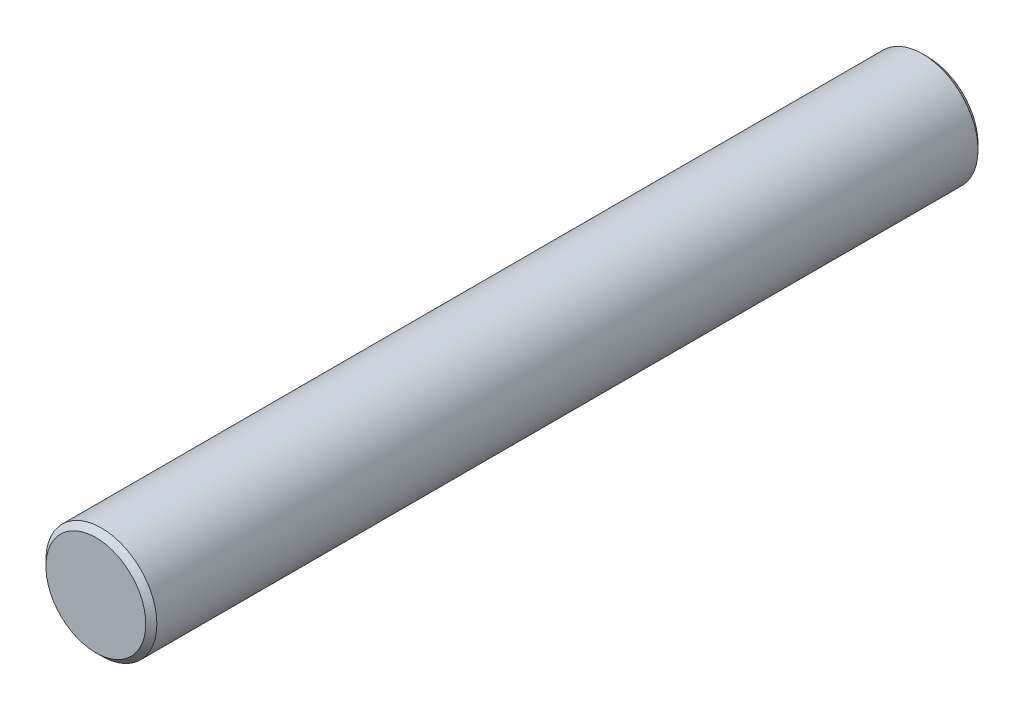
ISO-10303-21;
HEADER;
FILE_DESCRIPTION(('STEP AP214'),'2;1');
FILE_NAME('part.step','',(''),(''),'','','');
FILE_SCHEMA(('AUTOMOTIVE_DESIGN { 1 0 10303 214 1 1 1 1 }'));
ENDSEC;
DATA;
#1=APPLICATION_CONTEXT('core data for automotive mechanical design processes');
#2=APPLICATION_PROTOCOL_DEFINITION('international standard','automotive_design',2000,#1);
#3=PRODUCT_CONTEXT('',#1,'mechanical');
#4=PRODUCT('Part','Part','',(#3));
#5=PRODUCT_RELATED_PRODUCT_CATEGORY('part','',(#4));
#6=PRODUCT_DEFINITION_FORMATION('','',#4);
#7=PRODUCT_DEFINITION_CONTEXT('part definition',#1,'design');
#8=PRODUCT_DEFINITION('design','',#6,#7);
#9=PRODUCT_DEFINITION_SHAPE('','',#8);
#10=(LENGTH_UNIT() NAMED_UNIT(*) SI_UNIT(.MILLI.,.METRE.));
#11=(NAMED_UNIT(*) PLANE_ANGLE_UNIT() SI_UNIT($,.RADIAN.));
#12=(NAMED_UNIT(*) SI_UNIT($,.STERADIAN.) SOLID_ANGLE_UNIT());
#13=UNCERTAINTY_MEASURE_WITH_UNIT(LENGTH_MEASURE(1.E-05),#10,'distance_accuracy_value','');
#14=(GEOMETRIC_REPRESENTATION_CONTEXT(3) GLOBAL_UNCERTAINTY_ASSIGNED_CONTEXT((#13)) GLOBAL_UNIT_ASSIGNED_CONTEXT((#10,
#11,#12)) REPRESENTATION_CONTEXT('',''));
#15=CARTESIAN_POINT('',(0.,0.,0.));
#16=DIRECTION('',(0.,0.,1.));
#17=DIRECTION('',(1.,0.,0.));
#18=AXIS2_PLACEMENT_3D('',#15,#16,#17);
#19=CARTESIAN_POINT('',(0.,0.,30.));
#20=DIRECTION('',(0.,0.,-1.));
#21=DIRECTION('',(-1.,0.,0.));
#22=AXIS2_PLACEMENT_3D('',#19,#20,#21);
#23=CYLINDRICAL_SURFACE('',#22,2.);
#24=CARTESIAN_POINT('',(0.,0.,0.199999999999992));
#25=DIRECTION('',(0.,0.,1.));
#26=DIRECTION('',(1.,0.,0.));
#27=AXIS2_PLACEMENT_3D('',#24,#25,#26);
#28=CIRCLE('',#27,2.);
#29=CARTESIAN_POINT('',(2.,0.,0.199999999999992));
#30=VERTEX_POINT('',#29);
#31=EDGE_CURVE('E43',#30,#30,#28,.T.);
#32=ORIENTED_EDGE('',*,*,#31,.T.);
#33=EDGE_LOOP('',(#32));
#34=FACE_BOUND('',#33,.T.);
#35=CARTESIAN_POINT('',(0.,0.,29.8));
#36=DIRECTION('',(0.,0.,1.));
#37=DIRECTION('',(1.,0.,0.));
#38=AXIS2_PLACEMENT_3D('',#35,#36,#37);
#39=CIRCLE('',#38,2.);
#40=CARTESIAN_POINT('',(2.,0.,29.8));
#41=VERTEX_POINT('',#40);
#42=EDGE_CURVE('E47',#41,#41,#39,.F.);
#43=ORIENTED_EDGE('',*,*,#42,.T.);
#44=EDGE_LOOP('',(#43));
#45=FACE_BOUND('',#44,.T.);
#46=ADVANCED_FACE('F32',(#34,#45),#23,.T.);
#47=CARTESIAN_POINT('',(0.,0.,30.));
#48=DIRECTION('',(0.,0.,1.));
#49=DIRECTION('',(1.,0.,0.));
#50=AXIS2_PLACEMENT_3D('',#47,#48,#49);
#51=PLANE('',#50);
#52=CARTESIAN_POINT('',(0.,0.,30.));
#53=DIRECTION('',(0.,0.,1.));
#54=DIRECTION('',(1.,0.,0.));
#55=AXIS2_PLACEMENT_3D('',#52,#53,#54);
#56=CIRCLE('',#55,1.8);
#57=CARTESIAN_POINT('',(1.8,0.,30.));
#58=VERTEX_POINT('',#57);
#59=EDGE_CURVE('E10',#58,#58,#56,.T.);
#60=ORIENTED_EDGE('',*,*,#59,.T.);
#61=EDGE_LOOP('',(#60));
#62=FACE_BOUND('',#61,.T.);
#63=ADVANCED_FACE('F63',(#62),#51,.T.);
#64=CARTESIAN_POINT('',(0.,0.,0.));
#65=DIRECTION('',(0.,0.,1.));
#66=DIRECTION('',(1.,0.,0.));
#67=AXIS2_PLACEMENT_3D('',#64,#65,#66);
#68=PLANE('',#67);
#69=CARTESIAN_POINT('',(0.,0.,0.));
#70=DIRECTION('',(0.,0.,1.));
#71=DIRECTION('',(1.,0.,0.));
#72=AXIS2_PLACEMENT_3D('',#69,#70,#71);
#73=CIRCLE('',#72,1.80000000000001);
#74=CARTESIAN_POINT('',(1.80000000000001,0.,0.));
#75=VERTEX_POINT('',#74);
#76=EDGE_CURVE('E39',#75,#75,#73,.F.);
#77=ORIENTED_EDGE('',*,*,#76,.T.);
#78=EDGE_LOOP('',(#77));
#79=FACE_BOUND('',#78,.T.);
#80=ADVANCED_FACE('F60',(#79),#68,.F.);
#81=CARTESIAN_POINT('',(0.,0.,0.199999999999992));
#82=DIRECTION('',(0.,0.,1.));
#83=DIRECTION('',(1.,0.,0.));
#84=AXIS2_PLACEMENT_3D('',#81,#82,#83);
#85=CONICAL_SURFACE('',#84,2.,0.785398163397457);
#86=ORIENTED_EDGE('',*,*,#76,.F.);
#87=EDGE_LOOP('',(#86));
#88=FACE_BOUND('',#87,.T.);
#89=ORIENTED_EDGE('',*,*,#31,.F.);
#90=EDGE_LOOP('',(#89));
#91=FACE_BOUND('',#90,.T.);
#92=ADVANCED_FACE('F56',(#88,#91),#85,.T.);
#93=CARTESIAN_POINT('',(0.,0.,30.));
#94=DIRECTION('',(0.,0.,-1.));
#95=DIRECTION('',(-1.,0.,0.));
#96=AXIS2_PLACEMENT_3D('',#93,#94,#95);
#97=CONICAL_SURFACE('',#96,1.8,0.78539816339744);
#98=ORIENTED_EDGE('',*,*,#42,.F.);
#99=EDGE_LOOP('',(#98));
#100=FACE_BOUND('',#99,.T.);
#101=ORIENTED_EDGE('',*,*,#59,.F.);
#102=EDGE_LOOP('',(#101));
#103=FACE_BOUND('',#102,.T.);
#104=ADVANCED_FACE('F34',(#100,#103),#97,.T.);
#105=CLOSED_SHELL('',(#46,#63,#80,#92,#104));
#106=MANIFOLD_SOLID_BREP('B2',#105);
#107=ADVANCED_BREP_SHAPE_REPRESENTATION('',(#18,#106),#14);
#108=SHAPE_DEFINITION_REPRESENTATION(#9,#107);
ENDSEC;
END-ISO-10303-21;
